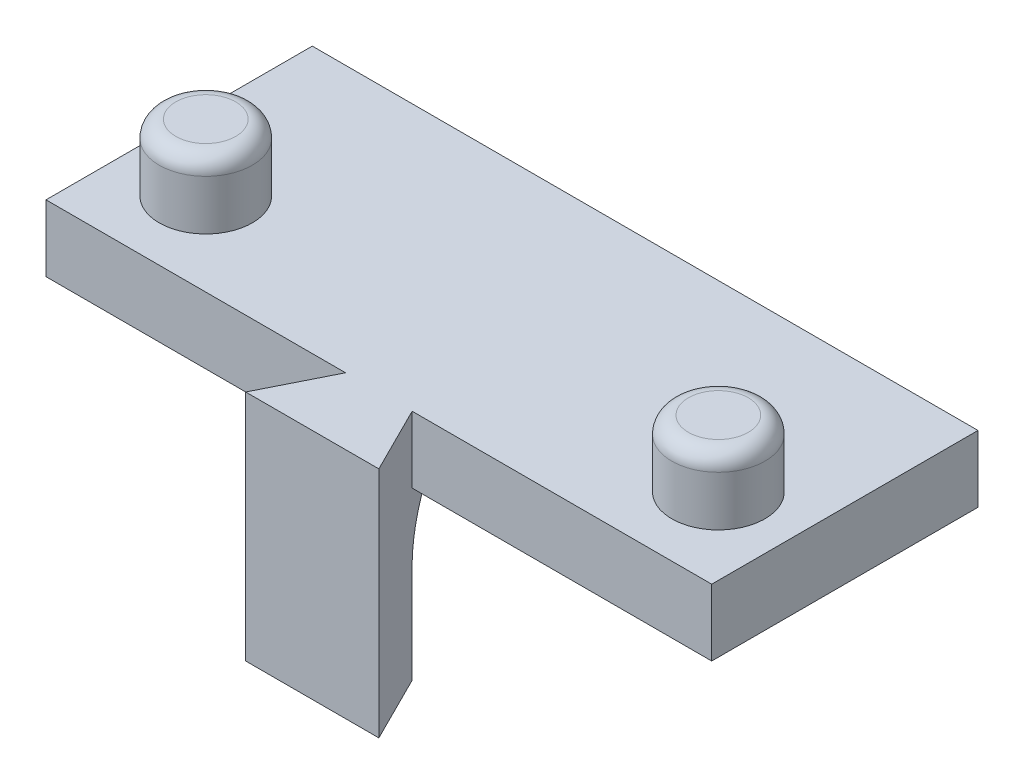
ISO-10303-21;
HEADER;
FILE_DESCRIPTION(('STEP AP214'),'2;1');
FILE_NAME('part.step','',(''),(''),'','','');
FILE_SCHEMA(('AUTOMOTIVE_DESIGN { 1 0 10303 214 1 1 1 1 }'));
ENDSEC;
DATA;
#1=APPLICATION_CONTEXT('core data for automotive mechanical design processes');
#2=APPLICATION_PROTOCOL_DEFINITION('international standard','automotive_design',2000,#1);
#3=PRODUCT_CONTEXT('',#1,'mechanical');
#4=PRODUCT('Part','Part','',(#3));
#5=PRODUCT_RELATED_PRODUCT_CATEGORY('part','',(#4));
#6=PRODUCT_DEFINITION_FORMATION('','',#4);
#7=PRODUCT_DEFINITION_CONTEXT('part definition',#1,'design');
#8=PRODUCT_DEFINITION('design','',#6,#7);
#9=PRODUCT_DEFINITION_SHAPE('','',#8);
#10=(LENGTH_UNIT() NAMED_UNIT(*) SI_UNIT(.MILLI.,.METRE.));
#11=(NAMED_UNIT(*) PLANE_ANGLE_UNIT() SI_UNIT($,.RADIAN.));
#12=(NAMED_UNIT(*) SI_UNIT($,.STERADIAN.) SOLID_ANGLE_UNIT());
#13=UNCERTAINTY_MEASURE_WITH_UNIT(LENGTH_MEASURE(1.E-05),#10,'distance_accuracy_value','');
#14=(GEOMETRIC_REPRESENTATION_CONTEXT(3) GLOBAL_UNCERTAINTY_ASSIGNED_CONTEXT((#13)) GLOBAL_UNIT_ASSIGNED_CONTEXT((#10,
#11,#12)) REPRESENTATION_CONTEXT('',''));
#15=CARTESIAN_POINT('',(0.,0.,0.));
#16=DIRECTION('',(0.,0.,1.));
#17=DIRECTION('',(1.,0.,0.));
#18=AXIS2_PLACEMENT_3D('',#15,#16,#17);
#19=CARTESIAN_POINT('',(0.,0.,0.));
#20=DIRECTION('',(0.,1.,0.));
#21=DIRECTION('',(0.,0.,1.));
#22=AXIS2_PLACEMENT_3D('',#19,#20,#21);
#23=PLANE('',#22);
#24=DIRECTION('',(1.,0.,0.));
#25=VECTOR('',#24,1.);
#26=CARTESIAN_POINT('',(11.,0.,8.));
#27=LINE('',#26,#25);
#28=CARTESIAN_POINT('',(11.,0.,8.));
#29=VERTEX_POINT('',#28);
#30=CARTESIAN_POINT('',(20.,0.,8.));
#31=VERTEX_POINT('',#30);
#32=EDGE_CURVE('E195',#29,#31,#27,.T.);
#33=ORIENTED_EDGE('',*,*,#32,.F.);
#34=DIRECTION('',(-0.447213595499958,0.,-0.894427190999916));
#35=VECTOR('',#34,1.);
#36=CARTESIAN_POINT('',(11.,0.,8.));
#37=LINE('',#36,#35);
#38=CARTESIAN_POINT('',(10.,0.,6.));
#39=VERTEX_POINT('',#38);
#40=EDGE_CURVE('E55',#29,#39,#37,.T.);
#41=ORIENTED_EDGE('',*,*,#40,.T.);
#42=DIRECTION('',(-0.447213595499958,0.,0.894427190999916));
#43=VECTOR('',#42,1.);
#44=CARTESIAN_POINT('',(8.,0.,10.));
#45=LINE('',#44,#43);
#46=CARTESIAN_POINT('',(9.,0.,8.));
#47=VERTEX_POINT('',#46);
#48=EDGE_CURVE('E62',#39,#47,#45,.T.);
#49=ORIENTED_EDGE('',*,*,#48,.T.);
#50=DIRECTION('',(1.,0.,0.));
#51=VECTOR('',#50,1.);
#52=CARTESIAN_POINT('',(0.,0.,8.));
#53=LINE('',#52,#51);
#54=CARTESIAN_POINT('',(0.,0.,8.));
#55=VERTEX_POINT('',#54);
#56=EDGE_CURVE('E191',#55,#47,#53,.T.);
#57=ORIENTED_EDGE('',*,*,#56,.F.);
#58=DIRECTION('',(0.,0.,1.));
#59=VECTOR('',#58,1.);
#60=CARTESIAN_POINT('',(0.,0.,0.));
#61=LINE('',#60,#59);
#62=CARTESIAN_POINT('',(0.,0.,0.));
#63=VERTEX_POINT('',#62);
#64=EDGE_CURVE('E160',#63,#55,#61,.T.);
#65=ORIENTED_EDGE('',*,*,#64,.F.);
#66=DIRECTION('',(-1.,0.,0.));
#67=VECTOR('',#66,1.);
#68=CARTESIAN_POINT('',(0.,0.,0.));
#69=LINE('',#68,#67);
#70=CARTESIAN_POINT('',(20.,0.,0.));
#71=VERTEX_POINT('',#70);
#72=EDGE_CURVE('E166',#71,#63,#69,.T.);
#73=ORIENTED_EDGE('',*,*,#72,.F.);
#74=DIRECTION('',(0.,0.,-1.));
#75=VECTOR('',#74,1.);
#76=CARTESIAN_POINT('',(20.,0.,0.));
#77=LINE('',#76,#75);
#78=EDGE_CURVE('E198',#31,#71,#77,.T.);
#79=ORIENTED_EDGE('',*,*,#78,.F.);
#80=EDGE_LOOP('',(#33,#41,#49,#57,#65,#73,#79));
#81=FACE_BOUND('',#80,.T.);
#82=ADVANCED_FACE('F39',(#81),#23,.F.);
#83=CARTESIAN_POINT('',(0.,2.,0.));
#84=DIRECTION('',(1.,0.,0.));
#85=DIRECTION('',(0.,0.,-1.));
#86=AXIS2_PLACEMENT_3D('',#83,#84,#85);
#87=PLANE('',#86);
#88=ORIENTED_EDGE('',*,*,#64,.T.);
#89=DIRECTION('',(0.,-1.,0.));
#90=VECTOR('',#89,1.);
#91=CARTESIAN_POINT('',(0.,2.,8.));
#92=LINE('',#91,#90);
#93=CARTESIAN_POINT('',(0.,2.,8.));
#94=VERTEX_POINT('',#93);
#95=EDGE_CURVE('E227',#94,#55,#92,.T.);
#96=ORIENTED_EDGE('',*,*,#95,.F.);
#97=DIRECTION('',(0.,0.,1.));
#98=VECTOR('',#97,1.);
#99=CARTESIAN_POINT('',(0.,2.,0.));
#100=LINE('',#99,#98);
#101=CARTESIAN_POINT('',(0.,2.,0.));
#102=VERTEX_POINT('',#101);
#103=EDGE_CURVE('E161',#102,#94,#100,.T.);
#104=ORIENTED_EDGE('',*,*,#103,.F.);
#105=DIRECTION('',(0.,-1.,0.));
#106=VECTOR('',#105,1.);
#107=CARTESIAN_POINT('',(0.,2.,0.));
#108=LINE('',#107,#106);
#109=EDGE_CURVE('E187',#102,#63,#108,.T.);
#110=ORIENTED_EDGE('',*,*,#109,.T.);
#111=EDGE_LOOP('',(#88,#96,#104,#110));
#112=FACE_BOUND('',#111,.T.);
#113=ADVANCED_FACE('F264',(#112),#87,.F.);
#114=CARTESIAN_POINT('',(0.,2.,8.));
#115=DIRECTION('',(0.,0.,-1.));
#116=DIRECTION('',(-1.,0.,0.));
#117=AXIS2_PLACEMENT_3D('',#114,#115,#116);
#118=PLANE('',#117);
#119=ORIENTED_EDGE('',*,*,#56,.T.);
#120=DIRECTION('',(0.,-1.,0.));
#121=VECTOR('',#120,1.);
#122=CARTESIAN_POINT('',(9.,2.,8.));
#123=LINE('',#122,#121);
#124=CARTESIAN_POINT('',(9.,2.,8.));
#125=VERTEX_POINT('',#124);
#126=EDGE_CURVE('E224',#125,#47,#123,.T.);
#127=ORIENTED_EDGE('',*,*,#126,.F.);
#128=DIRECTION('',(1.,0.,0.));
#129=VECTOR('',#128,1.);
#130=CARTESIAN_POINT('',(0.,2.,8.));
#131=LINE('',#130,#129);
#132=EDGE_CURVE('E165',#94,#125,#131,.T.);
#133=ORIENTED_EDGE('',*,*,#132,.F.);
#134=ORIENTED_EDGE('',*,*,#95,.T.);
#135=EDGE_LOOP('',(#119,#127,#133,#134));
#136=FACE_BOUND('',#135,.T.);
#137=ADVANCED_FACE('F269',(#136),#118,.F.);
#138=CARTESIAN_POINT('',(8.,2.,10.));
#139=DIRECTION('',(0.894427190999916,0.,0.447213595499958));
#140=DIRECTION('',(0.447213595499958,0.,-0.894427190999916));
#141=AXIS2_PLACEMENT_3D('',#138,#139,#140);
#142=PLANE('',#141);
#143=ORIENTED_EDGE('',*,*,#126,.T.);
#144=ORIENTED_EDGE('',*,*,#48,.F.);
#145=CARTESIAN_POINT('',(10.,-2.,6.));
#146=DIRECTION('',(0.894427190999916,0.,0.447213595499958));
#147=DIRECTION('',(-0.447213595499958,0.,0.894427190999916));
#148=AXIS2_PLACEMENT_3D('',#145,#146,#147);
#149=ELLIPSE('',#148,2.23606797749979,2.);
#150=CARTESIAN_POINT('',(9.,-2.,8.));
#151=VERTEX_POINT('',#150);
#152=EDGE_CURVE('E11',#39,#151,#149,.T.);
#153=ORIENTED_EDGE('',*,*,#152,.T.);
#154=DIRECTION('',(0.,1.,0.));
#155=VECTOR('',#154,1.);
#156=CARTESIAN_POINT('',(9.,-5.,8.));
#157=LINE('',#156,#155);
#158=CARTESIAN_POINT('',(9.,-5.,8.));
#159=VERTEX_POINT('',#158);
#160=EDGE_CURVE('E125',#159,#151,#157,.T.);
#161=ORIENTED_EDGE('',*,*,#160,.F.);
#162=DIRECTION('',(0.447213595499958,0.,-0.894427190999916));
#163=VECTOR('',#162,1.);
#164=CARTESIAN_POINT('',(9.,-5.,8.));
#165=LINE('',#164,#163);
#166=CARTESIAN_POINT('',(8.,-5.,10.));
#167=VERTEX_POINT('',#166);
#168=EDGE_CURVE('E134',#167,#159,#165,.T.);
#169=ORIENTED_EDGE('',*,*,#168,.F.);
#170=DIRECTION('',(0.,-1.,0.));
#171=VECTOR('',#170,1.);
#172=CARTESIAN_POINT('',(8.,2.,10.));
#173=LINE('',#172,#171);
#174=CARTESIAN_POINT('',(8.,2.,10.));
#175=VERTEX_POINT('',#174);
#176=EDGE_CURVE('E221',#175,#167,#173,.T.);
#177=ORIENTED_EDGE('',*,*,#176,.F.);
#178=DIRECTION('',(-0.447213595499958,0.,0.894427190999916));
#179=VECTOR('',#178,1.);
#180=CARTESIAN_POINT('',(8.,2.,10.));
#181=LINE('',#180,#179);
#182=EDGE_CURVE('E169',#125,#175,#181,.T.);
#183=ORIENTED_EDGE('',*,*,#182,.F.);
#184=EDGE_LOOP('',(#143,#144,#153,#161,#169,#177,#183));
#185=FACE_BOUND('',#184,.T.);
#186=ADVANCED_FACE('F144',(#185),#142,.F.);
#187=CARTESIAN_POINT('',(8.,2.,10.));
#188=DIRECTION('',(0.,0.,-1.));
#189=DIRECTION('',(-1.,0.,0.));
#190=AXIS2_PLACEMENT_3D('',#187,#188,#189);
#191=PLANE('',#190);
#192=ORIENTED_EDGE('',*,*,#176,.T.);
#193=DIRECTION('',(-1.,0.,0.));
#194=VECTOR('',#193,1.);
#195=CARTESIAN_POINT('',(8.,-5.,10.));
#196=LINE('',#195,#194);
#197=CARTESIAN_POINT('',(12.,-5.,10.));
#198=VERTEX_POINT('',#197);
#199=EDGE_CURVE('E140',#198,#167,#196,.T.);
#200=ORIENTED_EDGE('',*,*,#199,.F.);
#201=DIRECTION('',(0.,-1.,0.));
#202=VECTOR('',#201,1.);
#203=CARTESIAN_POINT('',(12.,2.,10.));
#204=LINE('',#203,#202);
#205=CARTESIAN_POINT('',(12.,2.,10.));
#206=VERTEX_POINT('',#205);
#207=EDGE_CURVE('E218',#206,#198,#204,.T.);
#208=ORIENTED_EDGE('',*,*,#207,.F.);
#209=DIRECTION('',(1.,0.,0.));
#210=VECTOR('',#209,1.);
#211=CARTESIAN_POINT('',(8.,2.,10.));
#212=LINE('',#211,#210);
#213=EDGE_CURVE('E172',#175,#206,#212,.T.);
#214=ORIENTED_EDGE('',*,*,#213,.F.);
#215=EDGE_LOOP('',(#192,#200,#208,#214));
#216=FACE_BOUND('',#215,.T.);
#217=ADVANCED_FACE('F290',(#216),#191,.F.);
#218=CARTESIAN_POINT('',(11.,2.,8.));
#219=DIRECTION('',(-0.894427190999916,0.,0.447213595499958));
#220=DIRECTION('',(0.447213595499958,0.,0.894427190999916));
#221=AXIS2_PLACEMENT_3D('',#218,#219,#220);
#222=PLANE('',#221);
#223=ORIENTED_EDGE('',*,*,#207,.T.);
#224=DIRECTION('',(0.447213595499958,0.,0.894427190999916));
#225=VECTOR('',#224,1.);
#226=CARTESIAN_POINT('',(12.,-5.,10.));
#227=LINE('',#226,#225);
#228=CARTESIAN_POINT('',(11.,-5.,8.));
#229=VERTEX_POINT('',#228);
#230=EDGE_CURVE('E133',#229,#198,#227,.T.);
#231=ORIENTED_EDGE('',*,*,#230,.F.);
#232=DIRECTION('',(0.,1.,0.));
#233=VECTOR('',#232,1.);
#234=CARTESIAN_POINT('',(11.,-5.,8.));
#235=LINE('',#234,#233);
#236=CARTESIAN_POINT('',(11.,-2.,8.));
#237=VERTEX_POINT('',#236);
#238=EDGE_CURVE('E128',#229,#237,#235,.T.);
#239=ORIENTED_EDGE('',*,*,#238,.T.);
#240=CARTESIAN_POINT('',(10.,-2.,6.));
#241=DIRECTION('',(-0.894427190999916,0.,0.447213595499958));
#242=DIRECTION('',(-0.447213595499958,0.,-0.894427190999916));
#243=AXIS2_PLACEMENT_3D('',#240,#241,#242);
#244=ELLIPSE('',#243,2.23606797749979,2.);
#245=EDGE_CURVE('E48',#237,#39,#244,.T.);
#246=ORIENTED_EDGE('',*,*,#245,.T.);
#247=ORIENTED_EDGE('',*,*,#40,.F.);
#248=DIRECTION('',(0.,-1.,0.));
#249=VECTOR('',#248,1.);
#250=CARTESIAN_POINT('',(11.,2.,8.));
#251=LINE('',#250,#249);
#252=CARTESIAN_POINT('',(11.,2.,8.));
#253=VERTEX_POINT('',#252);
#254=EDGE_CURVE('E214',#253,#29,#251,.T.);
#255=ORIENTED_EDGE('',*,*,#254,.F.);
#256=DIRECTION('',(-0.447213595499958,0.,-0.894427190999916));
#257=VECTOR('',#256,1.);
#258=CARTESIAN_POINT('',(11.,2.,8.));
#259=LINE('',#258,#257);
#260=EDGE_CURVE('E175',#206,#253,#259,.T.);
#261=ORIENTED_EDGE('',*,*,#260,.F.);
#262=EDGE_LOOP('',(#223,#231,#239,#246,#247,#255,#261));
#263=FACE_BOUND('',#262,.T.);
#264=ADVANCED_FACE('F254',(#263),#222,.F.);
#265=CARTESIAN_POINT('',(11.,2.,8.));
#266=DIRECTION('',(0.,0.,-1.));
#267=DIRECTION('',(-1.,0.,0.));
#268=AXIS2_PLACEMENT_3D('',#265,#266,#267);
#269=PLANE('',#268);
#270=ORIENTED_EDGE('',*,*,#32,.T.);
#271=DIRECTION('',(0.,-1.,0.));
#272=VECTOR('',#271,1.);
#273=CARTESIAN_POINT('',(20.,2.,8.));
#274=LINE('',#273,#272);
#275=CARTESIAN_POINT('',(20.,2.,8.));
#276=VERTEX_POINT('',#275);
#277=EDGE_CURVE('E210',#276,#31,#274,.T.);
#278=ORIENTED_EDGE('',*,*,#277,.F.);
#279=DIRECTION('',(1.,0.,0.));
#280=VECTOR('',#279,1.);
#281=CARTESIAN_POINT('',(11.,2.,8.));
#282=LINE('',#281,#280);
#283=EDGE_CURVE('E178',#253,#276,#282,.T.);
#284=ORIENTED_EDGE('',*,*,#283,.F.);
#285=ORIENTED_EDGE('',*,*,#254,.T.);
#286=EDGE_LOOP('',(#270,#278,#284,#285));
#287=FACE_BOUND('',#286,.T.);
#288=ADVANCED_FACE('F283',(#287),#269,.F.);
#289=CARTESIAN_POINT('',(20.,2.,0.));
#290=DIRECTION('',(-1.,0.,0.));
#291=DIRECTION('',(0.,0.,1.));
#292=AXIS2_PLACEMENT_3D('',#289,#290,#291);
#293=PLANE('',#292);
#294=ORIENTED_EDGE('',*,*,#78,.T.);
#295=DIRECTION('',(0.,-1.,0.));
#296=VECTOR('',#295,1.);
#297=CARTESIAN_POINT('',(20.,2.,0.));
#298=LINE('',#297,#296);
#299=CARTESIAN_POINT('',(20.,2.,0.));
#300=VERTEX_POINT('',#299);
#301=EDGE_CURVE('E206',#300,#71,#298,.T.);
#302=ORIENTED_EDGE('',*,*,#301,.F.);
#303=DIRECTION('',(0.,0.,-1.));
#304=VECTOR('',#303,1.);
#305=CARTESIAN_POINT('',(20.,2.,0.));
#306=LINE('',#305,#304);
#307=EDGE_CURVE('E181',#276,#300,#306,.T.);
#308=ORIENTED_EDGE('',*,*,#307,.F.);
#309=ORIENTED_EDGE('',*,*,#277,.T.);
#310=EDGE_LOOP('',(#294,#302,#308,#309));
#311=FACE_BOUND('',#310,.T.);
#312=ADVANCED_FACE('F279',(#311),#293,.F.);
#313=CARTESIAN_POINT('',(0.,2.,0.));
#314=DIRECTION('',(0.,0.,1.));
#315=DIRECTION('',(1.,0.,0.));
#316=AXIS2_PLACEMENT_3D('',#313,#314,#315);
#317=PLANE('',#316);
#318=ORIENTED_EDGE('',*,*,#72,.T.);
#319=ORIENTED_EDGE('',*,*,#109,.F.);
#320=DIRECTION('',(-1.,0.,0.));
#321=VECTOR('',#320,1.);
#322=CARTESIAN_POINT('',(0.,2.,0.));
#323=LINE('',#322,#321);
#324=EDGE_CURVE('E184',#300,#102,#323,.T.);
#325=ORIENTED_EDGE('',*,*,#324,.F.);
#326=ORIENTED_EDGE('',*,*,#301,.T.);
#327=EDGE_LOOP('',(#318,#319,#325,#326));
#328=FACE_BOUND('',#327,.T.);
#329=ADVANCED_FACE('F276',(#328),#317,.F.);
#330=CARTESIAN_POINT('',(0.,2.,0.));
#331=DIRECTION('',(0.,1.,0.));
#332=DIRECTION('',(0.,0.,1.));
#333=AXIS2_PLACEMENT_3D('',#330,#331,#332);
#334=PLANE('',#333);
#335=CARTESIAN_POINT('',(17.7,2.,5.5));
#336=DIRECTION('',(0.,1.,0.));
#337=DIRECTION('',(0.,0.,-1.));
#338=AXIS2_PLACEMENT_3D('',#335,#336,#337);
#339=CIRCLE('',#338,1.4);
#340=CARTESIAN_POINT('',(17.7,2.,4.1));
#341=VERTEX_POINT('',#340);
#342=EDGE_CURVE('E147',#341,#341,#339,.T.);
#343=ORIENTED_EDGE('',*,*,#342,.F.);
#344=EDGE_LOOP('',(#343));
#345=FACE_BOUND('',#344,.T.);
#346=CARTESIAN_POINT('',(2.3,2.,5.5));
#347=DIRECTION('',(0.,1.,0.));
#348=DIRECTION('',(0.,0.,1.));
#349=AXIS2_PLACEMENT_3D('',#346,#347,#348);
#350=CIRCLE('',#349,1.4);
#351=CARTESIAN_POINT('',(2.3,2.,6.9));
#352=VERTEX_POINT('',#351);
#353=EDGE_CURVE('E152',#352,#352,#350,.T.);
#354=ORIENTED_EDGE('',*,*,#353,.F.);
#355=EDGE_LOOP('',(#354));
#356=FACE_BOUND('',#355,.T.);
#357=ORIENTED_EDGE('',*,*,#103,.T.);
#358=ORIENTED_EDGE('',*,*,#132,.T.);
#359=ORIENTED_EDGE('',*,*,#182,.T.);
#360=ORIENTED_EDGE('',*,*,#213,.T.);
#361=ORIENTED_EDGE('',*,*,#260,.T.);
#362=ORIENTED_EDGE('',*,*,#283,.T.);
#363=ORIENTED_EDGE('',*,*,#307,.T.);
#364=ORIENTED_EDGE('',*,*,#324,.T.);
#365=EDGE_LOOP('',(#357,#358,#359,#360,#361,#362,#363,#364));
#366=FACE_BOUND('',#365,.T.);
#367=ADVANCED_FACE('F274',(#345,#356,#366),#334,.T.);
#368=CARTESIAN_POINT('',(2.3,4.,5.5));
#369=DIRECTION('',(0.,-1.,0.));
#370=DIRECTION('',(0.,0.,-1.));
#371=AXIS2_PLACEMENT_3D('',#368,#369,#370);
#372=CYLINDRICAL_SURFACE('',#371,1.4);
#373=CARTESIAN_POINT('',(2.3,3.5,5.5));
#374=DIRECTION('',(0.,1.,0.));
#375=DIRECTION('',(0.,0.,1.));
#376=AXIS2_PLACEMENT_3D('',#373,#374,#375);
#377=CIRCLE('',#376,1.4);
#378=CARTESIAN_POINT('',(2.3,3.5,6.9));
#379=VERTEX_POINT('',#378);
#380=EDGE_CURVE('E243',#379,#379,#377,.F.);
#381=ORIENTED_EDGE('',*,*,#380,.T.);
#382=EDGE_LOOP('',(#381));
#383=FACE_BOUND('',#382,.T.);
#384=ORIENTED_EDGE('',*,*,#353,.T.);
#385=EDGE_LOOP('',(#384));
#386=FACE_BOUND('',#385,.T.);
#387=ADVANCED_FACE('F317',(#383,#386),#372,.T.);
#388=CARTESIAN_POINT('',(2.3,4.,5.5));
#389=DIRECTION('',(0.,1.,0.));
#390=DIRECTION('',(0.,0.,1.));
#391=AXIS2_PLACEMENT_3D('',#388,#389,#390);
#392=PLANE('',#391);
#393=CARTESIAN_POINT('',(2.3,4.,5.5));
#394=DIRECTION('',(0.,1.,0.));
#395=DIRECTION('',(0.,0.,1.));
#396=AXIS2_PLACEMENT_3D('',#393,#394,#395);
#397=CIRCLE('',#396,0.9);
#398=CARTESIAN_POINT('',(2.3,4.,6.4));
#399=VERTEX_POINT('',#398);
#400=EDGE_CURVE('E239',#399,#399,#397,.T.);
#401=ORIENTED_EDGE('',*,*,#400,.T.);
#402=EDGE_LOOP('',(#401));
#403=FACE_BOUND('',#402,.T.);
#404=ADVANCED_FACE('F314',(#403),#392,.T.);
#405=CARTESIAN_POINT('',(17.7,4.,5.5));
#406=DIRECTION('',(0.,-1.,0.));
#407=DIRECTION('',(0.,0.,-1.));
#408=AXIS2_PLACEMENT_3D('',#405,#406,#407);
#409=CYLINDRICAL_SURFACE('',#408,1.4);
#410=CARTESIAN_POINT('',(17.7,3.5,5.5));
#411=DIRECTION('',(0.,-1.,0.));
#412=DIRECTION('',(0.,0.,-1.));
#413=AXIS2_PLACEMENT_3D('',#410,#411,#412);
#414=CIRCLE('',#413,1.4);
#415=CARTESIAN_POINT('',(17.7,3.5,4.1));
#416=VERTEX_POINT('',#415);
#417=EDGE_CURVE('E235',#416,#416,#414,.T.);
#418=ORIENTED_EDGE('',*,*,#417,.T.);
#419=EDGE_LOOP('',(#418));
#420=FACE_BOUND('',#419,.T.);
#421=ORIENTED_EDGE('',*,*,#342,.T.);
#422=EDGE_LOOP('',(#421));
#423=FACE_BOUND('',#422,.T.);
#424=ADVANCED_FACE('F316',(#420,#423),#409,.T.);
#425=CARTESIAN_POINT('',(17.7,4.,5.5));
#426=DIRECTION('',(0.,-1.,0.));
#427=DIRECTION('',(0.,0.,-1.));
#428=AXIS2_PLACEMENT_3D('',#425,#426,#427);
#429=PLANE('',#428);
#430=CARTESIAN_POINT('',(17.7,4.,5.5));
#431=DIRECTION('',(0.,-1.,0.));
#432=DIRECTION('',(0.,0.,-1.));
#433=AXIS2_PLACEMENT_3D('',#430,#431,#432);
#434=CIRCLE('',#433,0.899999999999999);
#435=CARTESIAN_POINT('',(17.7,4.,4.6));
#436=VERTEX_POINT('',#435);
#437=EDGE_CURVE('E231',#436,#436,#434,.F.);
#438=ORIENTED_EDGE('',*,*,#437,.T.);
#439=EDGE_LOOP('',(#438));
#440=FACE_BOUND('',#439,.T.);
#441=ADVANCED_FACE('F302',(#440),#429,.F.);
#442=CARTESIAN_POINT('',(17.7,3.5,5.5));
#443=DIRECTION('',(0.,-1.,0.));
#444=DIRECTION('',(0.,0.,-1.));
#445=AXIS2_PLACEMENT_3D('',#442,#443,#444);
#446=TOROIDAL_SURFACE('',#445,0.899999999999999,0.5);
#447=ORIENTED_EDGE('',*,*,#417,.F.);
#448=EDGE_LOOP('',(#447));
#449=FACE_BOUND('',#448,.T.);
#450=ORIENTED_EDGE('',*,*,#437,.F.);
#451=EDGE_LOOP('',(#450));
#452=FACE_BOUND('',#451,.T.);
#453=ADVANCED_FACE('F299',(#449,#452),#446,.T.);
#454=CARTESIAN_POINT('',(2.3,3.5,5.5));
#455=DIRECTION('',(0.,1.,0.));
#456=DIRECTION('',(0.,0.,1.));
#457=AXIS2_PLACEMENT_3D('',#454,#455,#456);
#458=TOROIDAL_SURFACE('',#457,0.9,0.5);
#459=ORIENTED_EDGE('',*,*,#380,.F.);
#460=EDGE_LOOP('',(#459));
#461=FACE_BOUND('',#460,.T.);
#462=ORIENTED_EDGE('',*,*,#400,.F.);
#463=EDGE_LOOP('',(#462));
#464=FACE_BOUND('',#463,.T.);
#465=ADVANCED_FACE('F301',(#461,#464),#458,.T.);
#466=CARTESIAN_POINT('',(11.,-5.,8.));
#467=DIRECTION('',(0.,0.,1.));
#468=DIRECTION('',(1.,0.,0.));
#469=AXIS2_PLACEMENT_3D('',#466,#467,#468);
#470=PLANE('',#469);
#471=ORIENTED_EDGE('',*,*,#160,.T.);
#472=DIRECTION('',(1.,0.,0.));
#473=VECTOR('',#472,1.);
#474=CARTESIAN_POINT('',(11.,-2.,8.));
#475=LINE('',#474,#473);
#476=EDGE_CURVE('E247',#151,#237,#475,.T.);
#477=ORIENTED_EDGE('',*,*,#476,.T.);
#478=ORIENTED_EDGE('',*,*,#238,.F.);
#479=DIRECTION('',(1.,0.,0.));
#480=VECTOR('',#479,1.);
#481=CARTESIAN_POINT('',(11.,-5.,8.));
#482=LINE('',#481,#480);
#483=EDGE_CURVE('E120',#159,#229,#482,.T.);
#484=ORIENTED_EDGE('',*,*,#483,.F.);
#485=EDGE_LOOP('',(#471,#477,#478,#484));
#486=FACE_BOUND('',#485,.T.);
#487=ADVANCED_FACE('F122',(#486),#470,.F.);
#488=CARTESIAN_POINT('',(0.,-5.,0.));
#489=DIRECTION('',(0.,1.,0.));
#490=DIRECTION('',(0.,0.,1.));
#491=AXIS2_PLACEMENT_3D('',#488,#489,#490);
#492=PLANE('',#491);
#493=ORIENTED_EDGE('',*,*,#168,.T.);
#494=ORIENTED_EDGE('',*,*,#483,.T.);
#495=ORIENTED_EDGE('',*,*,#230,.T.);
#496=ORIENTED_EDGE('',*,*,#199,.T.);
#497=EDGE_LOOP('',(#493,#494,#495,#496));
#498=FACE_BOUND('',#497,.T.);
#499=ADVANCED_FACE('F138',(#498),#492,.F.);
#500=CARTESIAN_POINT('',(11.,-2.,6.));
#501=DIRECTION('',(-1.,0.,0.));
#502=DIRECTION('',(0.,0.,1.));
#503=AXIS2_PLACEMENT_3D('',#500,#501,#502);
#504=CYLINDRICAL_SURFACE('',#503,2.);
#505=ORIENTED_EDGE('',*,*,#476,.F.);
#506=ORIENTED_EDGE('',*,*,#152,.F.);
#507=ORIENTED_EDGE('',*,*,#245,.F.);
#508=EDGE_LOOP('',(#505,#506,#507));
#509=FACE_BOUND('',#508,.T.);
#510=ADVANCED_FACE('F41',(#509),#504,.F.);
#511=CLOSED_SHELL('',(#82,#113,#137,#186,#217,#264,#288,#312,#329,#367,#387,#404,#424,#441,#453,
#465,#487,#499,#510));
#512=MANIFOLD_SOLID_BREP('B2',#511);
#513=ADVANCED_BREP_SHAPE_REPRESENTATION('',(#18,#512),#14);
#514=SHAPE_DEFINITION_REPRESENTATION(#9,#513);
ENDSEC;
END-ISO-10303-21;
